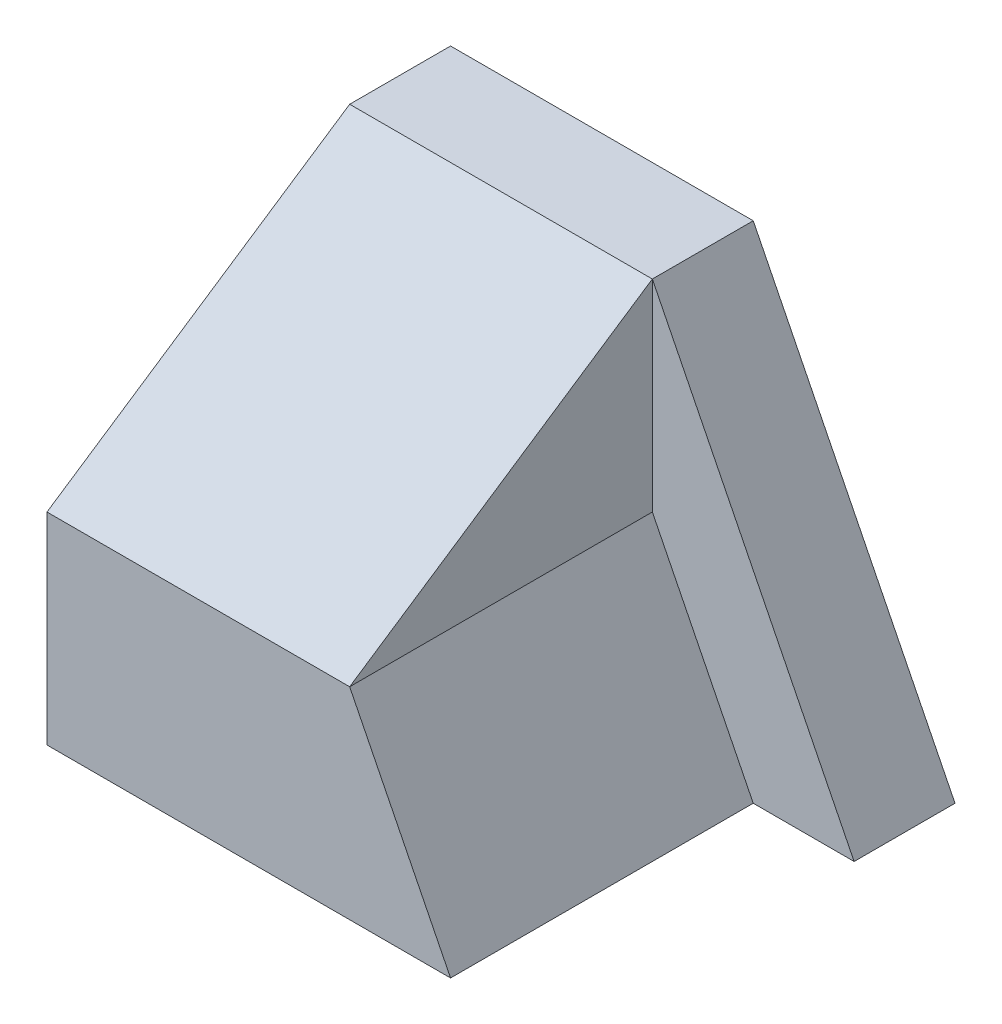
ISO-10303-21;
HEADER;
FILE_DESCRIPTION(('STEP AP214'),'2;1');
FILE_NAME('part.step','',(''),(''),'','','');
FILE_SCHEMA(('AUTOMOTIVE_DESIGN { 1 0 10303 214 1 1 1 1 }'));
ENDSEC;
DATA;
#1=APPLICATION_CONTEXT('core data for automotive mechanical design processes');
#2=APPLICATION_PROTOCOL_DEFINITION('international standard','automotive_design',2000,#1);
#3=PRODUCT_CONTEXT('',#1,'mechanical');
#4=PRODUCT('Part','Part','',(#3));
#5=PRODUCT_RELATED_PRODUCT_CATEGORY('part','',(#4));
#6=PRODUCT_DEFINITION_FORMATION('','',#4);
#7=PRODUCT_DEFINITION_CONTEXT('part definition',#1,'design');
#8=PRODUCT_DEFINITION('design','',#6,#7);
#9=PRODUCT_DEFINITION_SHAPE('','',#8);
#10=(LENGTH_UNIT() NAMED_UNIT(*) SI_UNIT(.MILLI.,.METRE.));
#11=(NAMED_UNIT(*) PLANE_ANGLE_UNIT() SI_UNIT($,.RADIAN.));
#12=(NAMED_UNIT(*) SI_UNIT($,.STERADIAN.) SOLID_ANGLE_UNIT());
#13=UNCERTAINTY_MEASURE_WITH_UNIT(LENGTH_MEASURE(1.E-05),#10,'distance_accuracy_value','');
#14=(GEOMETRIC_REPRESENTATION_CONTEXT(3) GLOBAL_UNCERTAINTY_ASSIGNED_CONTEXT((#13)) GLOBAL_UNIT_ASSIGNED_CONTEXT((#10,
#11,#12)) REPRESENTATION_CONTEXT('',''));
#15=CARTESIAN_POINT('',(0.,0.,0.));
#16=DIRECTION('',(0.,0.,1.));
#17=DIRECTION('',(1.,0.,0.));
#18=AXIS2_PLACEMENT_3D('',#15,#16,#17);
#19=CARTESIAN_POINT('',(3.,2.,3.));
#20=DIRECTION('',(0.,1.,0.));
#21=DIRECTION('',(-1.,0.,0.));
#22=AXIS2_PLACEMENT_3D('',#19,#20,#21);
#23=PLANE('',#22);
#24=DIRECTION('',(1.,0.,0.));
#25=VECTOR('',#24,1.);
#26=CARTESIAN_POINT('',(3.,2.,0.));
#27=LINE('',#26,#25);
#28=CARTESIAN_POINT('',(0.,2.,0.));
#29=VERTEX_POINT('',#28);
#30=CARTESIAN_POINT('',(3.,2.,0.));
#31=VERTEX_POINT('',#30);
#32=EDGE_CURVE('E84',#29,#31,#27,.T.);
#33=ORIENTED_EDGE('',*,*,#32,.T.);
#34=DIRECTION('',(0.,0.,-1.));
#35=VECTOR('',#34,1.);
#36=CARTESIAN_POINT('',(3.,2.,3.));
#37=LINE('',#36,#35);
#38=CARTESIAN_POINT('',(3.,2.,3.));
#39=VERTEX_POINT('',#38);
#40=EDGE_CURVE('E12',#39,#31,#37,.T.);
#41=ORIENTED_EDGE('',*,*,#40,.F.);
#42=DIRECTION('',(1.,0.,0.));
#43=VECTOR('',#42,1.);
#44=CARTESIAN_POINT('',(3.,2.,3.));
#45=LINE('',#44,#43);
#46=CARTESIAN_POINT('',(0.,2.,3.));
#47=VERTEX_POINT('',#46);
#48=EDGE_CURVE('E81',#47,#39,#45,.T.);
#49=ORIENTED_EDGE('',*,*,#48,.F.);
#50=DIRECTION('',(0.,0.,-1.));
#51=VECTOR('',#50,1.);
#52=CARTESIAN_POINT('',(0.,2.,3.));
#53=LINE('',#52,#51);
#54=EDGE_CURVE('E52',#47,#29,#53,.T.);
#55=ORIENTED_EDGE('',*,*,#54,.T.);
#56=EDGE_LOOP('',(#33,#41,#49,#55));
#57=FACE_BOUND('',#56,.T.);
#58=ADVANCED_FACE('F45',(#57),#23,.F.);
#59=CARTESIAN_POINT('',(3.,4.,3.));
#60=DIRECTION('',(-1.,0.,0.));
#61=DIRECTION('',(0.,-1.,0.));
#62=AXIS2_PLACEMENT_3D('',#59,#60,#61);
#63=PLANE('',#62);
#64=DIRECTION('',(0.,1.,0.));
#65=VECTOR('',#64,1.);
#66=CARTESIAN_POINT('',(3.,4.,0.));
#67=LINE('',#66,#65);
#68=CARTESIAN_POINT('',(3.,4.,0.));
#69=VERTEX_POINT('',#68);
#70=EDGE_CURVE('E96',#31,#69,#67,.T.);
#71=ORIENTED_EDGE('',*,*,#70,.T.);
#72=DIRECTION('',(0.,0.554700196225229,-0.832050294337844));
#73=VECTOR('',#72,1.);
#74=CARTESIAN_POINT('',(3.,2.76923076923077,1.84615384615385));
#75=LINE('',#74,#73);
#76=EDGE_CURVE('E67',#39,#69,#75,.T.);
#77=ORIENTED_EDGE('',*,*,#76,.F.);
#78=ORIENTED_EDGE('',*,*,#40,.T.);
#79=EDGE_LOOP('',(#71,#77,#78));
#80=FACE_BOUND('',#79,.T.);
#81=ADVANCED_FACE('F99',(#80),#63,.F.);
#82=CARTESIAN_POINT('',(0.,2.,3.));
#83=DIRECTION('',(1.,0.,0.));
#84=DIRECTION('',(0.,0.,-1.));
#85=AXIS2_PLACEMENT_3D('',#82,#83,#84);
#86=PLANE('',#85);
#87=ORIENTED_EDGE('',*,*,#54,.F.);
#88=DIRECTION('',(0.,0.554700196225229,-0.832050294337844));
#89=VECTOR('',#88,1.);
#90=CARTESIAN_POINT('',(0.,2.76923076923077,1.84615384615385));
#91=LINE('',#90,#89);
#92=CARTESIAN_POINT('',(0.,4.,0.));
#93=VERTEX_POINT('',#92);
#94=EDGE_CURVE('E78',#47,#93,#91,.T.);
#95=ORIENTED_EDGE('',*,*,#94,.T.);
#96=DIRECTION('',(0.,-1.,0.));
#97=VECTOR('',#96,1.);
#98=CARTESIAN_POINT('',(0.,2.,0.));
#99=LINE('',#98,#97);
#100=EDGE_CURVE('E59',#93,#29,#99,.T.);
#101=ORIENTED_EDGE('',*,*,#100,.T.);
#102=EDGE_LOOP('',(#87,#95,#101));
#103=FACE_BOUND('',#102,.T.);
#104=ADVANCED_FACE('F86',(#103),#86,.F.);
#105=CARTESIAN_POINT('',(0.,0.,0.));
#106=DIRECTION('',(0.,0.,-1.));
#107=DIRECTION('',(-1.,0.,0.));
#108=AXIS2_PLACEMENT_3D('',#105,#106,#107);
#109=PLANE('',#108);
#110=ORIENTED_EDGE('',*,*,#32,.F.);
#111=ORIENTED_EDGE('',*,*,#100,.F.);
#112=DIRECTION('',(-1.,0.,0.));
#113=VECTOR('',#112,1.);
#114=CARTESIAN_POINT('',(0.,4.,0.));
#115=LINE('',#114,#113);
#116=EDGE_CURVE('E83',#69,#93,#115,.T.);
#117=ORIENTED_EDGE('',*,*,#116,.F.);
#118=ORIENTED_EDGE('',*,*,#70,.F.);
#119=EDGE_LOOP('',(#110,#111,#117,#118));
#120=FACE_BOUND('',#119,.T.);
#121=ADVANCED_FACE('F101',(#120),#109,.T.);
#122=CARTESIAN_POINT('',(0.,2.76923076923077,1.84615384615385));
#123=DIRECTION('',(0.,-0.832050294337843,-0.554700196225229));
#124=DIRECTION('',(0.,0.554700196225229,-0.832050294337844));
#125=AXIS2_PLACEMENT_3D('',#122,#123,#124);
#126=PLANE('',#125);
#127=ORIENTED_EDGE('',*,*,#76,.T.);
#128=ORIENTED_EDGE('',*,*,#116,.T.);
#129=ORIENTED_EDGE('',*,*,#94,.F.);
#130=ORIENTED_EDGE('',*,*,#48,.T.);
#131=EDGE_LOOP('',(#127,#128,#129,#130));
#132=FACE_BOUND('',#131,.T.);
#133=ADVANCED_FACE('F79',(#132),#126,.F.);
#134=CLOSED_SHELL('',(#58,#81,#104,#121,#133));
#135=MANIFOLD_SOLID_BREP('B2',#134);
#136=CARTESIAN_POINT('',(0.,4.,0.));
#137=DIRECTION('',(0.,0.,-1.));
#138=DIRECTION('',(-1.,0.,0.));
#139=AXIS2_PLACEMENT_3D('',#136,#137,#138);
#140=PLANE('',#139);
#141=DIRECTION('',(-1.,0.,0.));
#142=VECTOR('',#141,1.);
#143=CARTESIAN_POINT('',(0.,2.,0.));
#144=LINE('',#143,#142);
#145=CARTESIAN_POINT('',(3.,2.,0.));
#146=VERTEX_POINT('',#145);
#147=CARTESIAN_POINT('',(0.,2.,0.));
#148=VERTEX_POINT('',#147);
#149=EDGE_CURVE('E157',#146,#148,#144,.T.);
#150=ORIENTED_EDGE('',*,*,#149,.F.);
#151=DIRECTION('',(-0.447213595499958,0.894427190999916,0.));
#152=VECTOR('',#151,1.);
#153=CARTESIAN_POINT('',(3.,2.,0.));
#154=LINE('',#153,#152);
#155=CARTESIAN_POINT('',(4.,0.,0.));
#156=VERTEX_POINT('',#155);
#157=EDGE_CURVE('E193',#156,#146,#154,.T.);
#158=ORIENTED_EDGE('',*,*,#157,.F.);
#159=DIRECTION('',(-1.,0.,0.));
#160=VECTOR('',#159,1.);
#161=CARTESIAN_POINT('',(0.,0.,0.));
#162=LINE('',#161,#160);
#163=CARTESIAN_POINT('',(5.,0.,0.));
#164=VERTEX_POINT('',#163);
#165=EDGE_CURVE('E217',#164,#156,#162,.T.);
#166=ORIENTED_EDGE('',*,*,#165,.F.);
#167=DIRECTION('',(0.447213595499958,-0.894427190999916,0.));
#168=VECTOR('',#167,1.);
#169=CARTESIAN_POINT('',(3.,4.,0.));
#170=LINE('',#169,#168);
#171=CARTESIAN_POINT('',(3.,4.,0.));
#172=VERTEX_POINT('',#171);
#173=EDGE_CURVE('E257',#172,#164,#170,.T.);
#174=ORIENTED_EDGE('',*,*,#173,.F.);
#175=DIRECTION('',(1.,0.,0.));
#176=VECTOR('',#175,1.);
#177=CARTESIAN_POINT('',(0.,4.,0.));
#178=LINE('',#177,#176);
#179=CARTESIAN_POINT('',(0.,4.,0.));
#180=VERTEX_POINT('',#179);
#181=EDGE_CURVE('E242',#180,#172,#178,.T.);
#182=ORIENTED_EDGE('',*,*,#181,.F.);
#183=DIRECTION('',(0.,-1.,0.));
#184=VECTOR('',#183,1.);
#185=CARTESIAN_POINT('',(0.,4.,0.));
#186=LINE('',#185,#184);
#187=EDGE_CURVE('E43',#180,#148,#186,.T.);
#188=ORIENTED_EDGE('',*,*,#187,.T.);
#189=EDGE_LOOP('',(#150,#158,#166,#174,#182,#188));
#190=FACE_BOUND('',#189,.T.);
#191=ADVANCED_FACE('F143',(#190),#140,.F.);
#192=CARTESIAN_POINT('',(0.,4.,0.));
#193=DIRECTION('',(-1.,0.,0.));
#194=DIRECTION('',(0.,0.,1.));
#195=AXIS2_PLACEMENT_3D('',#192,#193,#194);
#196=PLANE('',#195);
#197=DIRECTION('',(0.,0.,-1.));
#198=VECTOR('',#197,1.);
#199=CARTESIAN_POINT('',(0.,0.,0.));
#200=LINE('',#199,#198);
#201=CARTESIAN_POINT('',(0.,0.,3.));
#202=VERTEX_POINT('',#201);
#203=CARTESIAN_POINT('',(0.,0.,-1.));
#204=VERTEX_POINT('',#203);
#205=EDGE_CURVE('E219',#202,#204,#200,.T.);
#206=ORIENTED_EDGE('',*,*,#205,.F.);
#207=DIRECTION('',(0.,-1.,0.));
#208=VECTOR('',#207,1.);
#209=CARTESIAN_POINT('',(0.,0.,3.));
#210=LINE('',#209,#208);
#211=CARTESIAN_POINT('',(0.,2.,3.));
#212=VERTEX_POINT('',#211);
#213=EDGE_CURVE('E208',#212,#202,#210,.T.);
#214=ORIENTED_EDGE('',*,*,#213,.F.);
#215=DIRECTION('',(0.,0.,-1.));
#216=VECTOR('',#215,1.);
#217=CARTESIAN_POINT('',(0.,2.,3.));
#218=LINE('',#217,#216);
#219=EDGE_CURVE('E225',#212,#148,#218,.T.);
#220=ORIENTED_EDGE('',*,*,#219,.T.);
#221=ORIENTED_EDGE('',*,*,#187,.F.);
#222=DIRECTION('',(0.,0.,-1.));
#223=VECTOR('',#222,1.);
#224=CARTESIAN_POINT('',(0.,4.,0.));
#225=LINE('',#224,#223);
#226=CARTESIAN_POINT('',(0.,4.,-1.));
#227=VERTEX_POINT('',#226);
#228=EDGE_CURVE('E233',#180,#227,#225,.T.);
#229=ORIENTED_EDGE('',*,*,#228,.T.);
#230=DIRECTION('',(0.,-1.,0.));
#231=VECTOR('',#230,1.);
#232=CARTESIAN_POINT('',(0.,4.,-1.));
#233=LINE('',#232,#231);
#234=EDGE_CURVE('E147',#227,#204,#233,.T.);
#235=ORIENTED_EDGE('',*,*,#234,.T.);
#236=EDGE_LOOP('',(#206,#214,#220,#221,#229,#235));
#237=FACE_BOUND('',#236,.T.);
#238=ADVANCED_FACE('F145',(#237),#196,.T.);
#239=CARTESIAN_POINT('',(0.,4.,-1.));
#240=DIRECTION('',(0.,0.,-1.));
#241=DIRECTION('',(-1.,0.,0.));
#242=AXIS2_PLACEMENT_3D('',#239,#240,#241);
#243=PLANE('',#242);
#244=DIRECTION('',(1.,0.,0.));
#245=VECTOR('',#244,1.);
#246=CARTESIAN_POINT('',(0.,0.,-1.));
#247=LINE('',#246,#245);
#248=CARTESIAN_POINT('',(5.,0.,-1.));
#249=VERTEX_POINT('',#248);
#250=EDGE_CURVE('E236',#204,#249,#247,.T.);
#251=ORIENTED_EDGE('',*,*,#250,.F.);
#252=ORIENTED_EDGE('',*,*,#234,.F.);
#253=DIRECTION('',(1.,0.,0.));
#254=VECTOR('',#253,1.);
#255=CARTESIAN_POINT('',(0.,4.,-1.));
#256=LINE('',#255,#254);
#257=CARTESIAN_POINT('',(3.,4.,-1.));
#258=VERTEX_POINT('',#257);
#259=EDGE_CURVE('E235',#227,#258,#256,.T.);
#260=ORIENTED_EDGE('',*,*,#259,.T.);
#261=DIRECTION('',(-0.447213595499958,0.894427190999916,0.));
#262=VECTOR('',#261,1.);
#263=CARTESIAN_POINT('',(2.4,5.2,-1.));
#264=LINE('',#263,#262);
#265=EDGE_CURVE('E255',#249,#258,#264,.T.);
#266=ORIENTED_EDGE('',*,*,#265,.F.);
#267=EDGE_LOOP('',(#251,#252,#260,#266));
#268=FACE_BOUND('',#267,.T.);
#269=ADVANCED_FACE('F259',(#268),#243,.T.);
#270=CARTESIAN_POINT('',(0.,4.,0.));
#271=DIRECTION('',(0.,-1.,0.));
#272=DIRECTION('',(0.,0.,-1.));
#273=AXIS2_PLACEMENT_3D('',#270,#271,#272);
#274=PLANE('',#273);
#275=ORIENTED_EDGE('',*,*,#228,.F.);
#276=ORIENTED_EDGE('',*,*,#181,.T.);
#277=DIRECTION('',(0.,0.,-1.));
#278=VECTOR('',#277,1.);
#279=CARTESIAN_POINT('',(3.,4.,0.));
#280=LINE('',#279,#278);
#281=EDGE_CURVE('E239',#172,#258,#280,.T.);
#282=ORIENTED_EDGE('',*,*,#281,.T.);
#283=ORIENTED_EDGE('',*,*,#259,.F.);
#284=EDGE_LOOP('',(#275,#276,#282,#283));
#285=FACE_BOUND('',#284,.T.);
#286=ADVANCED_FACE('F268',(#285),#274,.F.);
#287=CARTESIAN_POINT('',(0.,0.,0.));
#288=DIRECTION('',(0.,-1.,0.));
#289=DIRECTION('',(0.,0.,-1.));
#290=AXIS2_PLACEMENT_3D('',#287,#288,#289);
#291=PLANE('',#290);
#292=ORIENTED_EDGE('',*,*,#250,.T.);
#293=DIRECTION('',(0.,0.,1.));
#294=VECTOR('',#293,1.);
#295=CARTESIAN_POINT('',(5.,0.,0.));
#296=LINE('',#295,#294);
#297=EDGE_CURVE('E247',#249,#164,#296,.T.);
#298=ORIENTED_EDGE('',*,*,#297,.T.);
#299=ORIENTED_EDGE('',*,*,#165,.T.);
#300=DIRECTION('',(0.,0.,-1.));
#301=VECTOR('',#300,1.);
#302=CARTESIAN_POINT('',(4.,0.,3.));
#303=LINE('',#302,#301);
#304=CARTESIAN_POINT('',(4.,0.,3.));
#305=VERTEX_POINT('',#304);
#306=EDGE_CURVE('E213',#305,#156,#303,.T.);
#307=ORIENTED_EDGE('',*,*,#306,.F.);
#308=DIRECTION('',(1.,0.,0.));
#309=VECTOR('',#308,1.);
#310=CARTESIAN_POINT('',(0.,0.,3.));
#311=LINE('',#310,#309);
#312=EDGE_CURVE('E201',#202,#305,#311,.T.);
#313=ORIENTED_EDGE('',*,*,#312,.F.);
#314=ORIENTED_EDGE('',*,*,#205,.T.);
#315=EDGE_LOOP('',(#292,#298,#299,#307,#313,#314));
#316=FACE_BOUND('',#315,.T.);
#317=ADVANCED_FACE('F215',(#316),#291,.T.);
#318=CARTESIAN_POINT('',(3.,2.,3.));
#319=DIRECTION('',(-0.894427190999916,-0.447213595499958,0.));
#320=DIRECTION('',(0.447213595499958,-0.894427190999916,0.));
#321=AXIS2_PLACEMENT_3D('',#318,#319,#320);
#322=PLANE('',#321);
#323=ORIENTED_EDGE('',*,*,#157,.T.);
#324=DIRECTION('',(0.,0.,-1.));
#325=VECTOR('',#324,1.);
#326=CARTESIAN_POINT('',(3.,2.,3.));
#327=LINE('',#326,#325);
#328=CARTESIAN_POINT('',(3.,2.,3.));
#329=VERTEX_POINT('',#328);
#330=EDGE_CURVE('E220',#329,#146,#327,.T.);
#331=ORIENTED_EDGE('',*,*,#330,.F.);
#332=DIRECTION('',(-0.447213595499958,0.894427190999916,0.));
#333=VECTOR('',#332,1.);
#334=CARTESIAN_POINT('',(3.,2.,3.));
#335=LINE('',#334,#333);
#336=EDGE_CURVE('E205',#305,#329,#335,.T.);
#337=ORIENTED_EDGE('',*,*,#336,.F.);
#338=ORIENTED_EDGE('',*,*,#306,.T.);
#339=EDGE_LOOP('',(#323,#331,#337,#338));
#340=FACE_BOUND('',#339,.T.);
#341=ADVANCED_FACE('F222',(#340),#322,.F.);
#342=CARTESIAN_POINT('',(0.,2.,3.));
#343=DIRECTION('',(0.,-1.,0.));
#344=DIRECTION('',(0.,0.,-1.));
#345=AXIS2_PLACEMENT_3D('',#342,#343,#344);
#346=PLANE('',#345);
#347=ORIENTED_EDGE('',*,*,#149,.T.);
#348=ORIENTED_EDGE('',*,*,#219,.F.);
#349=DIRECTION('',(-1.,0.,0.));
#350=VECTOR('',#349,1.);
#351=CARTESIAN_POINT('',(0.,2.,3.));
#352=LINE('',#351,#350);
#353=EDGE_CURVE('E181',#329,#212,#352,.T.);
#354=ORIENTED_EDGE('',*,*,#353,.F.);
#355=ORIENTED_EDGE('',*,*,#330,.T.);
#356=EDGE_LOOP('',(#347,#348,#354,#355));
#357=FACE_BOUND('',#356,.T.);
#358=ADVANCED_FACE('F284',(#357),#346,.F.);
#359=CARTESIAN_POINT('',(0.,0.,3.));
#360=DIRECTION('',(0.,0.,-1.));
#361=DIRECTION('',(-1.,0.,0.));
#362=AXIS2_PLACEMENT_3D('',#359,#360,#361);
#363=PLANE('',#362);
#364=ORIENTED_EDGE('',*,*,#213,.T.);
#365=ORIENTED_EDGE('',*,*,#312,.T.);
#366=ORIENTED_EDGE('',*,*,#336,.T.);
#367=ORIENTED_EDGE('',*,*,#353,.T.);
#368=EDGE_LOOP('',(#364,#365,#366,#367));
#369=FACE_BOUND('',#368,.T.);
#370=ADVANCED_FACE('F203',(#369),#363,.F.);
#371=CARTESIAN_POINT('',(3.,4.,-4.));
#372=DIRECTION('',(-0.894427190999916,-0.447213595499958,0.));
#373=DIRECTION('',(0.447213595499958,-0.894427190999916,0.));
#374=AXIS2_PLACEMENT_3D('',#371,#372,#373);
#375=PLANE('',#374);
#376=ORIENTED_EDGE('',*,*,#265,.T.);
#377=ORIENTED_EDGE('',*,*,#281,.F.);
#378=ORIENTED_EDGE('',*,*,#173,.T.);
#379=ORIENTED_EDGE('',*,*,#297,.F.);
#380=EDGE_LOOP('',(#376,#377,#378,#379));
#381=FACE_BOUND('',#380,.T.);
#382=ADVANCED_FACE('F253',(#381),#375,.F.);
#383=CLOSED_SHELL('',(#191,#238,#269,#286,#317,#341,#358,#370,#382));
#384=MANIFOLD_SOLID_BREP('B6',#383);
#385=ADVANCED_BREP_SHAPE_REPRESENTATION('',(#18,#135,#384),#14);
#386=SHAPE_DEFINITION_REPRESENTATION(#9,#385);
ENDSEC;
END-ISO-10303-21;
